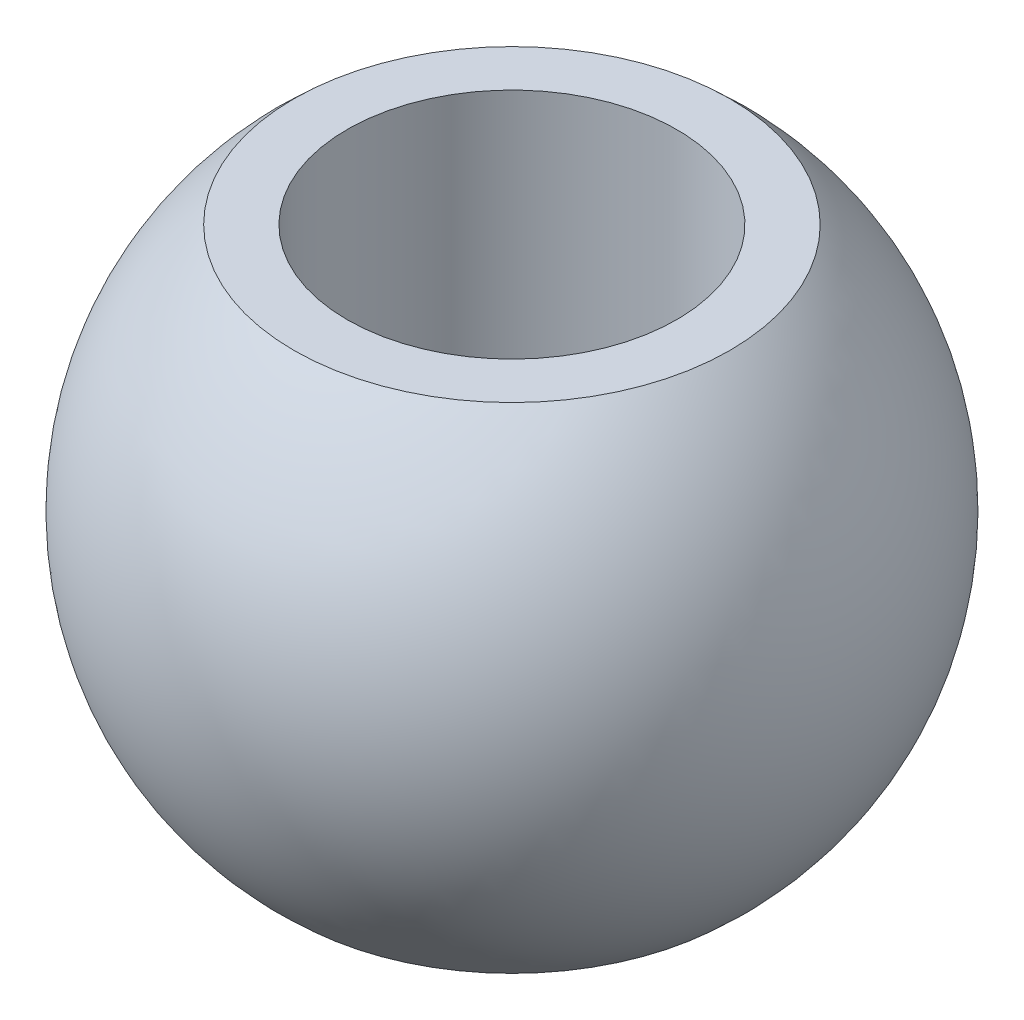
ISO-10303-21;
HEADER;
FILE_DESCRIPTION(('STEP AP214'),'2;1');
FILE_NAME('part.step','',(''),(''),'','','');
FILE_SCHEMA(('AUTOMOTIVE_DESIGN { 1 0 10303 214 1 1 1 1 }'));
ENDSEC;
DATA;
#1=APPLICATION_CONTEXT('core data for automotive mechanical design processes');
#2=APPLICATION_PROTOCOL_DEFINITION('international standard','automotive_design',2000,#1);
#3=PRODUCT_CONTEXT('',#1,'mechanical');
#4=PRODUCT('Part','Part','',(#3));
#5=PRODUCT_RELATED_PRODUCT_CATEGORY('part','',(#4));
#6=PRODUCT_DEFINITION_FORMATION('','',#4);
#7=PRODUCT_DEFINITION_CONTEXT('part definition',#1,'design');
#8=PRODUCT_DEFINITION('design','',#6,#7);
#9=PRODUCT_DEFINITION_SHAPE('','',#8);
#10=(LENGTH_UNIT() NAMED_UNIT(*) SI_UNIT(.MILLI.,.METRE.));
#11=(NAMED_UNIT(*) PLANE_ANGLE_UNIT() SI_UNIT($,.RADIAN.));
#12=(NAMED_UNIT(*) SI_UNIT($,.STERADIAN.) SOLID_ANGLE_UNIT());
#13=UNCERTAINTY_MEASURE_WITH_UNIT(LENGTH_MEASURE(1.E-05),#10,'distance_accuracy_value','');
#14=(GEOMETRIC_REPRESENTATION_CONTEXT(3) GLOBAL_UNCERTAINTY_ASSIGNED_CONTEXT((#13)) GLOBAL_UNIT_ASSIGNED_CONTEXT((#10,
#11,#12)) REPRESENTATION_CONTEXT('',''));
#15=CARTESIAN_POINT('',(0.,0.,0.));
#16=DIRECTION('',(0.,0.,1.));
#17=DIRECTION('',(1.,0.,0.));
#18=AXIS2_PLACEMENT_3D('',#15,#16,#17);
#19=CARTESIAN_POINT('',(0.,0.,0.));
#20=DIRECTION('',(0.,1.,0.));
#21=DIRECTION('',(1.,0.,0.));
#22=AXIS2_PLACEMENT_3D('',#19,#20,#21);
#23=SPHERICAL_SURFACE('',#22,6.35);
#24=CARTESIAN_POINT('',(0.,-4.7625,0.));
#25=DIRECTION('',(0.,-1.,0.));
#26=DIRECTION('',(0.,0.,-1.));
#27=AXIS2_PLACEMENT_3D('',#24,#25,#26);
#28=CIRCLE('',#27,4.20013020631504);
#29=CARTESIAN_POINT('',(4.20013020631504,-4.7625,0.));
#30=VERTEX_POINT('',#29);
#31=EDGE_CURVE('E37',#30,#30,#28,.T.);
#32=CARTESIAN_POINT('',(0.,4.7625,0.));
#33=DIRECTION('',(0.,1.,0.));
#34=DIRECTION('',(0.,0.,1.));
#35=AXIS2_PLACEMENT_3D('',#32,#33,#34);
#36=CIRCLE('',#35,4.20013020631504);
#37=CARTESIAN_POINT('',(4.20013020631504,4.7625,0.));
#38=VERTEX_POINT('',#37);
#39=EDGE_CURVE('E10',#38,#38,#36,.T.);
#40=CARTESIAN_POINT('',(4.20013020631504,-4.7625,0.));
#41=CARTESIAN_POINT('',(4.28427596259575,-4.68829441241714,0.));
#42=CARTESIAN_POINT('',(4.36645097123876,-4.61185462322146,0.));
#43=CARTESIAN_POINT('',(4.52663790593272,-4.45473074408904,0.));
#44=CARTESIAN_POINT('',(4.60464983198368,-4.37404665415228,0.));
#45=CARTESIAN_POINT('',(4.75628901417693,-4.2086582760222,0.));
#46=CARTESIAN_POINT('',(4.82991627031922,-4.12395398782887,0.));
#47=CARTESIAN_POINT('',(4.97257997398552,-3.95076380169117,0.));
#48=CARTESIAN_POINT('',(5.04161642150953,-3.86227790374679,0.));
#49=CARTESIAN_POINT('',(5.17490442415508,-3.68177285231924,0.));
#50=CARTESIAN_POINT('',(5.23915597927662,-3.58975369883608,0.));
#51=CARTESIAN_POINT('',(5.3626937778669,-3.40244064392613,0.));
#52=CARTESIAN_POINT('',(5.42198002133564,-3.30714674249934,0.));
#53=CARTESIAN_POINT('',(5.53542066343188,-3.11355183580631,0.));
#54=CARTESIAN_POINT('',(5.58957506205939,-3.01525083054008,0.));
#55=CARTESIAN_POINT('',(5.69259991152316,-2.81591782295192,0.));
#56=CARTESIAN_POINT('',(5.74147036235943,-2.71488582063,0.));
#57=CARTESIAN_POINT('',(5.83379005027065,-2.51037459200007,0.));
#58=CARTESIAN_POINT('',(5.8772392873456,-2.40689536569207,0.));
#59=CARTESIAN_POINT('',(5.95859450977743,-2.19778033699103,0.));
#60=CARTESIAN_POINT('',(5.99650049513431,-2.09214453459798,0.));
#61=CARTESIAN_POINT('',(6.06666274549085,-1.87901305860198,0.));
#62=CARTESIAN_POINT('',(6.09891901049051,-1.77151738499903,0.));
#63=CARTESIAN_POINT('',(6.15769122024921,-1.55496809546323,0.));
#64=CARTESIAN_POINT('',(6.18420716500825,-1.44591447953038,0.));
#65=CARTESIAN_POINT('',(6.23142425752524,-1.2265556100682,0.));
#66=CARTESIAN_POINT('',(6.25212540528318,-1.11625035653887,0.));
#67=CARTESIAN_POINT('',(6.2876547593756,-0.894698032164874,0.));
#68=CARTESIAN_POINT('',(6.30248296571007,-0.783450961320208,0.));
#69=CARTESIAN_POINT('',(6.32622478817701,-0.560327467927834,0.));
#70=CARTESIAN_POINT('',(6.33513840430949,-0.448451045380127,0.));
#71=CARTESIAN_POINT('',(6.34702601022098,-0.22438308188828,0.));
#72=CARTESIAN_POINT('',(6.35,-0.11219154094414,0.));
#73=CARTESIAN_POINT('',(6.35,0.112191540944141,0.));
#74=CARTESIAN_POINT('',(6.34702601022098,0.224383081888281,0.));
#75=CARTESIAN_POINT('',(6.33513840430949,0.448451045380129,0.));
#76=CARTESIAN_POINT('',(6.32622478817701,0.560327467927836,0.));
#77=CARTESIAN_POINT('',(6.30248296571007,0.783450961320209,0.));
#78=CARTESIAN_POINT('',(6.2876547593756,0.894698032164876,0.));
#79=CARTESIAN_POINT('',(6.25212540528318,1.11625035653887,0.));
#80=CARTESIAN_POINT('',(6.23142425752524,1.2265556100682,0.));
#81=CARTESIAN_POINT('',(6.18420716500825,1.44591447953038,0.));
#82=CARTESIAN_POINT('',(6.15769122024921,1.55496809546323,0.));
#83=CARTESIAN_POINT('',(6.09891901049051,1.77151738499903,0.));
#84=CARTESIAN_POINT('',(6.06666274549085,1.87901305860198,0.));
#85=CARTESIAN_POINT('',(5.99650049513431,2.09214453459798,0.));
#86=CARTESIAN_POINT('',(5.95859450977743,2.19778033699103,0.));
#87=CARTESIAN_POINT('',(5.8772392873456,2.40689536569208,0.));
#88=CARTESIAN_POINT('',(5.83379005027065,2.51037459200008,0.));
#89=CARTESIAN_POINT('',(5.74147036235943,2.71488582063,0.));
#90=CARTESIAN_POINT('',(5.69259991152316,2.81591782295193,0.));
#91=CARTESIAN_POINT('',(5.58957506205939,3.01525083054008,0.));
#92=CARTESIAN_POINT('',(5.53542066343188,3.11355183580631,0.));
#93=CARTESIAN_POINT('',(5.42198002133564,3.30714674249934,0.));
#94=CARTESIAN_POINT('',(5.3626937778669,3.40244064392613,0.));
#95=CARTESIAN_POINT('',(5.23915597927662,3.58975369883608,0.));
#96=CARTESIAN_POINT('',(5.17490442415508,3.68177285231925,0.));
#97=CARTESIAN_POINT('',(5.04161642150953,3.86227790374679,0.));
#98=CARTESIAN_POINT('',(4.97257997398552,3.95076380169117,0.));
#99=CARTESIAN_POINT('',(4.82991627031922,4.12395398782888,0.));
#100=CARTESIAN_POINT('',(4.75628901417693,4.2086582760222,0.));
#101=CARTESIAN_POINT('',(4.60464983198368,4.37404665415228,0.));
#102=CARTESIAN_POINT('',(4.52663790593272,4.45473074408904,0.));
#103=CARTESIAN_POINT('',(4.36645097123876,4.61185462322147,0.));
#104=CARTESIAN_POINT('',(4.28427596259575,4.68829441241714,0.));
#105=CARTESIAN_POINT('',(4.20013020631504,4.7625,0.));
#106=B_SPLINE_CURVE_WITH_KNOTS('',3,(#40,#41,#42,#43,#44,#45,#46,#47,#48,#49,#50,#51,#52,#53,
#54,#55,#56,#57,#58,#59,#60,#61,#62,#63,#64,#65,#66,#67,#68,#69,#70,#71,#72,#73,#74,#75,#76,#77,
#78,#79,#80,#81,#82,#83,#84,#85,#86,#87,#88,#89,#90,#91,#92,#93,#94,#95,#96,#97,#98,#99,#100,
#101,#102,#103,#104,#105),.UNSPECIFIED.,.F.,.F.,(4,2,2,2,2,2,2,2,2,2,2,2,2,2,2,2,2,2,2,2,2,2,2,
2,2,2,2,2,2,2,2,2,4),(0.,0.336535239954926,0.673070479909854,1.00960571986478,1.34614095981971,
1.68267619977463,2.01921143972956,2.35574667968449,2.69228191963942,3.02881715959434,
3.36535239954927,3.7018876395042,4.03842287945912,4.37495811941405,4.71149335936898,
5.04802859932391,5.38456383927883,5.72109907923376,6.05763431918869,6.39416955914361,
6.73070479909854,7.06724003905347,7.4037752790084,7.74031051896332,8.07684575891825,
8.41338099887318,8.7499162388281,9.08645147878303,9.42298671873796,9.75952195869289,
10.0960571986478,10.4325924386027,10.7691276785577),.UNSPECIFIED.);
#107=EDGE_CURVE('BSEAM31',#30,#38,#106,.T.);
#108=ORIENTED_EDGE('',*,*,#31,.F.);
#109=ORIENTED_EDGE('',*,*,#39,.F.);
#110=ORIENTED_EDGE('',*,*,#107,.T.);
#111=ORIENTED_EDGE('',*,*,#107,.F.);
#112=EDGE_LOOP('',(#108,#110,#109,#111));
#113=FACE_BOUND('',#112,.T.);
#114=ADVANCED_FACE('F31',(#113),#23,.T.);
#115=CARTESIAN_POINT('',(6.35,4.7625,0.));
#116=DIRECTION('',(0.,1.,0.));
#117=DIRECTION('',(0.,0.,1.));
#118=AXIS2_PLACEMENT_3D('',#115,#116,#117);
#119=PLANE('',#118);
#120=CARTESIAN_POINT('',(0.,4.7625,0.));
#121=DIRECTION('',(0.,1.,0.));
#122=DIRECTION('',(0.,0.,1.));
#123=AXIS2_PLACEMENT_3D('',#120,#121,#122);
#124=CIRCLE('',#123,3.175);
#125=CARTESIAN_POINT('',(0.,4.7625,3.175));
#126=VERTEX_POINT('',#125);
#127=EDGE_CURVE('E41',#126,#126,#124,.T.);
#128=ORIENTED_EDGE('',*,*,#127,.F.);
#129=EDGE_LOOP('',(#128));
#130=FACE_BOUND('',#129,.T.);
#131=ORIENTED_EDGE('',*,*,#39,.T.);
#132=EDGE_LOOP('',(#131));
#133=FACE_BOUND('',#132,.T.);
#134=ADVANCED_FACE('F60',(#130,#133),#119,.T.);
#135=CARTESIAN_POINT('',(3.175,-4.7625,0.));
#136=DIRECTION('',(0.,-1.,0.));
#137=DIRECTION('',(0.,0.,-1.));
#138=AXIS2_PLACEMENT_3D('',#135,#136,#137);
#139=PLANE('',#138);
#140=CARTESIAN_POINT('',(0.,-4.7625,0.));
#141=DIRECTION('',(0.,1.,0.));
#142=DIRECTION('',(0.,0.,1.));
#143=AXIS2_PLACEMENT_3D('',#140,#141,#142);
#144=CIRCLE('',#143,3.175);
#145=CARTESIAN_POINT('',(0.,-4.7625,3.175));
#146=VERTEX_POINT('',#145);
#147=EDGE_CURVE('E45',#146,#146,#144,.T.);
#148=ORIENTED_EDGE('',*,*,#147,.T.);
#149=EDGE_LOOP('',(#148));
#150=FACE_BOUND('',#149,.T.);
#151=ORIENTED_EDGE('',*,*,#31,.T.);
#152=EDGE_LOOP('',(#151));
#153=FACE_BOUND('',#152,.T.);
#154=ADVANCED_FACE('F51',(#150,#153),#139,.T.);
#155=CARTESIAN_POINT('',(0.,4.7625,0.));
#156=DIRECTION('',(0.,1.,0.));
#157=DIRECTION('',(0.,0.,1.));
#158=AXIS2_PLACEMENT_3D('',#155,#156,#157);
#159=CYLINDRICAL_SURFACE('',#158,3.175);
#160=ORIENTED_EDGE('',*,*,#127,.T.);
#161=EDGE_LOOP('',(#160));
#162=FACE_BOUND('',#161,.T.);
#163=ORIENTED_EDGE('',*,*,#147,.F.);
#164=EDGE_LOOP('',(#163));
#165=FACE_BOUND('',#164,.T.);
#166=ADVANCED_FACE('F53',(#162,#165),#159,.F.);
#167=CLOSED_SHELL('',(#114,#134,#154,#166));
#168=MANIFOLD_SOLID_BREP('B2',#167);
#169=ADVANCED_BREP_SHAPE_REPRESENTATION('',(#18,#168),#14);
#170=SHAPE_DEFINITION_REPRESENTATION(#9,#169);
ENDSEC;
END-ISO-10303-21;
